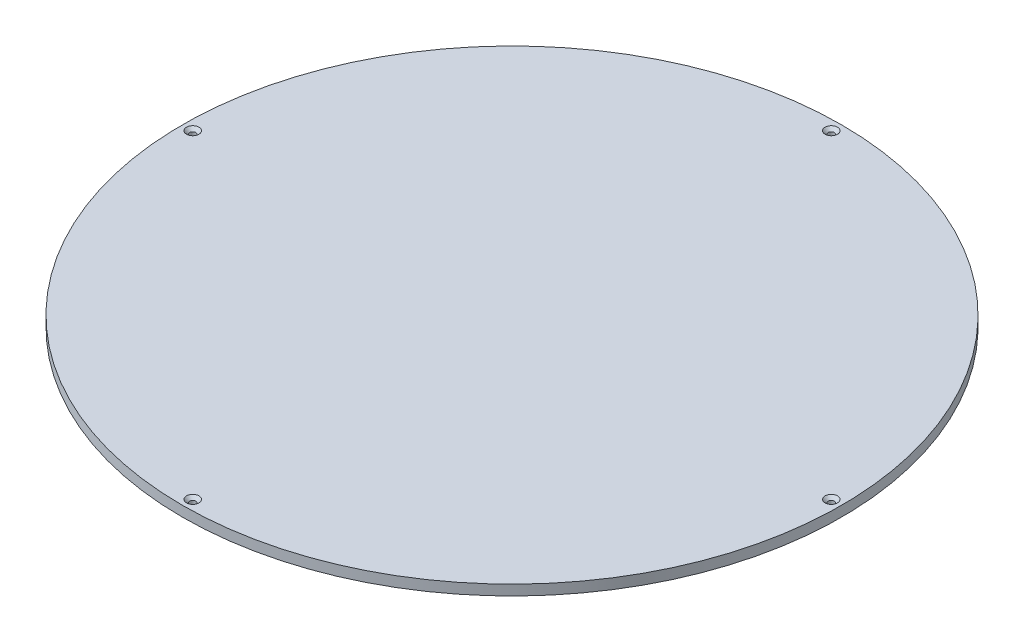
ISO-10303-21;
HEADER;
FILE_DESCRIPTION(('STEP AP214'),'2;1');
FILE_NAME('part.step','',(''),(''),'','','');
FILE_SCHEMA(('AUTOMOTIVE_DESIGN { 1 0 10303 214 1 1 1 1 }'));
ENDSEC;
DATA;
#1=APPLICATION_CONTEXT('core data for automotive mechanical design processes');
#2=APPLICATION_PROTOCOL_DEFINITION('international standard','automotive_design',2000,#1);
#3=PRODUCT_CONTEXT('',#1,'mechanical');
#4=PRODUCT('Part','Part','',(#3));
#5=PRODUCT_RELATED_PRODUCT_CATEGORY('part','',(#4));
#6=PRODUCT_DEFINITION_FORMATION('','',#4);
#7=PRODUCT_DEFINITION_CONTEXT('part definition',#1,'design');
#8=PRODUCT_DEFINITION('design','',#6,#7);
#9=PRODUCT_DEFINITION_SHAPE('','',#8);
#10=(LENGTH_UNIT() NAMED_UNIT(*) SI_UNIT(.MILLI.,.METRE.));
#11=(NAMED_UNIT(*) PLANE_ANGLE_UNIT() SI_UNIT($,.RADIAN.));
#12=(NAMED_UNIT(*) SI_UNIT($,.STERADIAN.) SOLID_ANGLE_UNIT());
#13=UNCERTAINTY_MEASURE_WITH_UNIT(LENGTH_MEASURE(1.E-05),#10,'distance_accuracy_value','');
#14=(GEOMETRIC_REPRESENTATION_CONTEXT(3) GLOBAL_UNCERTAINTY_ASSIGNED_CONTEXT((#13)) GLOBAL_UNIT_ASSIGNED_CONTEXT((#10,
#11,#12)) REPRESENTATION_CONTEXT('',''));
#15=CARTESIAN_POINT('',(0.,0.,0.));
#16=DIRECTION('',(0.,0.,1.));
#17=DIRECTION('',(1.,0.,0.));
#18=AXIS2_PLACEMENT_3D('',#15,#16,#17);
#19=CARTESIAN_POINT('',(0.,-5.,0.));
#20=DIRECTION('',(0.,1.,0.));
#21=DIRECTION('',(0.,0.,1.));
#22=AXIS2_PLACEMENT_3D('',#19,#20,#21);
#23=CYLINDRICAL_SURFACE('',#22,160.);
#24=CARTESIAN_POINT('',(0.,-5.,0.));
#25=DIRECTION('',(0.,1.,0.));
#26=DIRECTION('',(0.,0.,1.));
#27=AXIS2_PLACEMENT_3D('',#24,#25,#26);
#28=CIRCLE('',#27,160.);
#29=CARTESIAN_POINT('',(0.,-5.,160.));
#30=VERTEX_POINT('',#29);
#31=EDGE_CURVE('E65',#30,#30,#28,.T.);
#32=ORIENTED_EDGE('',*,*,#31,.T.);
#33=EDGE_LOOP('',(#32));
#34=FACE_BOUND('',#33,.T.);
#35=CARTESIAN_POINT('',(0.,0.,0.));
#36=DIRECTION('',(0.,1.,0.));
#37=DIRECTION('',(0.,0.,1.));
#38=AXIS2_PLACEMENT_3D('',#35,#36,#37);
#39=CIRCLE('',#38,160.);
#40=CARTESIAN_POINT('',(0.,0.,160.));
#41=VERTEX_POINT('',#40);
#42=EDGE_CURVE('E66',#41,#41,#39,.T.);
#43=ORIENTED_EDGE('',*,*,#42,.F.);
#44=EDGE_LOOP('',(#43));
#45=FACE_BOUND('',#44,.T.);
#46=ADVANCED_FACE('F33',(#34,#45),#23,.T.);
#47=CARTESIAN_POINT('',(0.,-5.,0.));
#48=DIRECTION('',(0.,1.,0.));
#49=DIRECTION('',(0.,0.,1.));
#50=AXIS2_PLACEMENT_3D('',#47,#48,#49);
#51=PLANE('',#50);
#52=CARTESIAN_POINT('',(1.62353882256206E-12,-5.,-155.));
#53=DIRECTION('',(0.,1.,0.));
#54=DIRECTION('',(0.,0.,1.));
#55=AXIS2_PLACEMENT_3D('',#52,#53,#54);
#56=CIRCLE('',#55,1.49999999999999);
#57=CARTESIAN_POINT('',(1.62353882256206E-12,-5.,-153.5));
#58=VERTEX_POINT('',#57);
#59=EDGE_CURVE('E80',#58,#58,#56,.T.);
#60=ORIENTED_EDGE('',*,*,#59,.T.);
#61=EDGE_LOOP('',(#60));
#62=FACE_BOUND('',#61,.T.);
#63=CARTESIAN_POINT('',(-155.,-5.,-1.08235921504137E-12));
#64=DIRECTION('',(0.,1.,0.));
#65=DIRECTION('',(0.,0.,1.));
#66=AXIS2_PLACEMENT_3D('',#63,#64,#65);
#67=CIRCLE('',#66,1.49999999999999);
#68=CARTESIAN_POINT('',(-155.,-5.,1.49999999999891));
#69=VERTEX_POINT('',#68);
#70=EDGE_CURVE('E77',#69,#69,#67,.T.);
#71=ORIENTED_EDGE('',*,*,#70,.T.);
#72=EDGE_LOOP('',(#71));
#73=FACE_BOUND('',#72,.T.);
#74=CARTESIAN_POINT('',(-5.41179607520686E-13,-5.,155.));
#75=DIRECTION('',(0.,1.,0.));
#76=DIRECTION('',(0.,0.,1.));
#77=AXIS2_PLACEMENT_3D('',#74,#75,#76);
#78=CIRCLE('',#77,1.5);
#79=CARTESIAN_POINT('',(-5.41179607520686E-13,-5.,156.5));
#80=VERTEX_POINT('',#79);
#81=EDGE_CURVE('E74',#80,#80,#78,.T.);
#82=ORIENTED_EDGE('',*,*,#81,.T.);
#83=EDGE_LOOP('',(#82));
#84=FACE_BOUND('',#83,.T.);
#85=CARTESIAN_POINT('',(155.,-5.,0.));
#86=DIRECTION('',(0.,1.,0.));
#87=DIRECTION('',(0.,0.,1.));
#88=AXIS2_PLACEMENT_3D('',#85,#86,#87);
#89=CIRCLE('',#88,1.5);
#90=CARTESIAN_POINT('',(155.,-5.,1.5));
#91=VERTEX_POINT('',#90);
#92=EDGE_CURVE('E69',#91,#91,#89,.T.);
#93=ORIENTED_EDGE('',*,*,#92,.T.);
#94=EDGE_LOOP('',(#93));
#95=FACE_BOUND('',#94,.T.);
#96=ORIENTED_EDGE('',*,*,#31,.F.);
#97=EDGE_LOOP('',(#96));
#98=FACE_BOUND('',#97,.T.);
#99=ADVANCED_FACE('F84',(#62,#73,#84,#95,#98),#51,.F.);
#100=CARTESIAN_POINT('',(0.,0.,0.));
#101=DIRECTION('',(0.,1.,0.));
#102=DIRECTION('',(0.,0.,1.));
#103=AXIS2_PLACEMENT_3D('',#100,#101,#102);
#104=PLANE('',#103);
#105=CARTESIAN_POINT('',(-155.,0.,-1.08235921504137E-12));
#106=DIRECTION('',(0.,1.,0.));
#107=DIRECTION('',(0.,0.,1.));
#108=AXIS2_PLACEMENT_3D('',#105,#106,#107);
#109=CIRCLE('',#108,2.99999999999995);
#110=CARTESIAN_POINT('',(-155.,0.,2.99999999999886));
#111=VERTEX_POINT('',#110);
#112=EDGE_CURVE('E48',#111,#111,#109,.F.);
#113=ORIENTED_EDGE('',*,*,#112,.T.);
#114=EDGE_LOOP('',(#113));
#115=FACE_BOUND('',#114,.T.);
#116=CARTESIAN_POINT('',(1.62353882256206E-12,0.,-155.));
#117=DIRECTION('',(0.,1.,0.));
#118=DIRECTION('',(0.,0.,1.));
#119=AXIS2_PLACEMENT_3D('',#116,#117,#118);
#120=CIRCLE('',#119,2.99999999999995);
#121=CARTESIAN_POINT('',(1.62353882256206E-12,0.,-152.));
#122=VERTEX_POINT('',#121);
#123=EDGE_CURVE('E53',#122,#122,#120,.F.);
#124=ORIENTED_EDGE('',*,*,#123,.T.);
#125=EDGE_LOOP('',(#124));
#126=FACE_BOUND('',#125,.T.);
#127=CARTESIAN_POINT('',(-5.41179607520686E-13,0.,155.));
#128=DIRECTION('',(0.,1.,0.));
#129=DIRECTION('',(0.,0.,1.));
#130=AXIS2_PLACEMENT_3D('',#127,#128,#129);
#131=CIRCLE('',#130,2.99999999999995);
#132=CARTESIAN_POINT('',(-5.41179607520686E-13,0.,158.));
#133=VERTEX_POINT('',#132);
#134=EDGE_CURVE('E56',#133,#133,#131,.F.);
#135=ORIENTED_EDGE('',*,*,#134,.T.);
#136=EDGE_LOOP('',(#135));
#137=FACE_BOUND('',#136,.T.);
#138=CARTESIAN_POINT('',(155.,0.,0.));
#139=DIRECTION('',(0.,1.,0.));
#140=DIRECTION('',(0.,0.,1.));
#141=AXIS2_PLACEMENT_3D('',#138,#139,#140);
#142=CIRCLE('',#141,3.);
#143=CARTESIAN_POINT('',(155.,0.,3.));
#144=VERTEX_POINT('',#143);
#145=EDGE_CURVE('E59',#144,#144,#142,.F.);
#146=ORIENTED_EDGE('',*,*,#145,.T.);
#147=EDGE_LOOP('',(#146));
#148=FACE_BOUND('',#147,.T.);
#149=ORIENTED_EDGE('',*,*,#42,.T.);
#150=EDGE_LOOP('',(#149));
#151=FACE_BOUND('',#150,.T.);
#152=ADVANCED_FACE('F109',(#115,#126,#137,#148,#151),#104,.T.);
#153=CARTESIAN_POINT('',(155.,-5.,0.));
#154=DIRECTION('',(0.,1.,0.));
#155=DIRECTION('',(0.,0.,1.));
#156=AXIS2_PLACEMENT_3D('',#153,#154,#155);
#157=CYLINDRICAL_SURFACE('',#156,1.5);
#158=CARTESIAN_POINT('',(155.,-1.49999999999996,0.));
#159=DIRECTION('',(0.,1.,0.));
#160=DIRECTION('',(0.,0.,1.));
#161=AXIS2_PLACEMENT_3D('',#158,#159,#160);
#162=CIRCLE('',#161,1.5);
#163=CARTESIAN_POINT('',(155.,-1.49999999999996,1.5));
#164=VERTEX_POINT('',#163);
#165=EDGE_CURVE('E10',#164,#164,#162,.T.);
#166=ORIENTED_EDGE('',*,*,#165,.T.);
#167=EDGE_LOOP('',(#166));
#168=FACE_BOUND('',#167,.T.);
#169=ORIENTED_EDGE('',*,*,#92,.F.);
#170=EDGE_LOOP('',(#169));
#171=FACE_BOUND('',#170,.T.);
#172=ADVANCED_FACE('F128',(#168,#171),#157,.F.);
#173=CARTESIAN_POINT('',(-5.41179607520686E-13,-5.,155.));
#174=DIRECTION('',(0.,1.,0.));
#175=DIRECTION('',(0.,0.,1.));
#176=AXIS2_PLACEMENT_3D('',#173,#174,#175);
#177=CYLINDRICAL_SURFACE('',#176,1.5);
#178=CARTESIAN_POINT('',(-5.41179607520686E-13,-1.49999999999996,155.));
#179=DIRECTION('',(0.,1.,0.));
#180=DIRECTION('',(0.,0.,1.));
#181=AXIS2_PLACEMENT_3D('',#178,#179,#180);
#182=CIRCLE('',#181,1.5);
#183=CARTESIAN_POINT('',(-5.41179607520686E-13,-1.49999999999996,156.5));
#184=VERTEX_POINT('',#183);
#185=EDGE_CURVE('E40',#184,#184,#182,.T.);
#186=ORIENTED_EDGE('',*,*,#185,.T.);
#187=EDGE_LOOP('',(#186));
#188=FACE_BOUND('',#187,.T.);
#189=ORIENTED_EDGE('',*,*,#81,.F.);
#190=EDGE_LOOP('',(#189));
#191=FACE_BOUND('',#190,.T.);
#192=ADVANCED_FACE('F100',(#188,#191),#177,.F.);
#193=CARTESIAN_POINT('',(-155.,-5.,-1.08235921504137E-12));
#194=DIRECTION('',(0.,1.,0.));
#195=DIRECTION('',(0.,0.,1.));
#196=AXIS2_PLACEMENT_3D('',#193,#194,#195);
#197=CYLINDRICAL_SURFACE('',#196,1.49999999999999);
#198=CARTESIAN_POINT('',(-155.,-1.49999999999996,-1.08235921504137E-12));
#199=DIRECTION('',(0.,1.,0.));
#200=DIRECTION('',(0.,0.,1.));
#201=AXIS2_PLACEMENT_3D('',#198,#199,#200);
#202=CIRCLE('',#201,1.49999999999999);
#203=CARTESIAN_POINT('',(-155.,-1.49999999999996,1.49999999999891));
#204=VERTEX_POINT('',#203);
#205=EDGE_CURVE('E62',#204,#204,#202,.T.);
#206=ORIENTED_EDGE('',*,*,#205,.T.);
#207=EDGE_LOOP('',(#206));
#208=FACE_BOUND('',#207,.T.);
#209=ORIENTED_EDGE('',*,*,#70,.F.);
#210=EDGE_LOOP('',(#209));
#211=FACE_BOUND('',#210,.T.);
#212=ADVANCED_FACE('F90',(#208,#211),#197,.F.);
#213=CARTESIAN_POINT('',(1.62353882256206E-12,-5.,-155.));
#214=DIRECTION('',(0.,1.,0.));
#215=DIRECTION('',(0.,0.,1.));
#216=AXIS2_PLACEMENT_3D('',#213,#214,#215);
#217=CYLINDRICAL_SURFACE('',#216,1.49999999999999);
#218=CARTESIAN_POINT('',(1.62353882256206E-12,-1.49999999999996,-155.));
#219=DIRECTION('',(0.,1.,0.));
#220=DIRECTION('',(0.,0.,1.));
#221=AXIS2_PLACEMENT_3D('',#218,#219,#220);
#222=CIRCLE('',#221,1.49999999999999);
#223=CARTESIAN_POINT('',(1.62353882256206E-12,-1.49999999999996,-153.5));
#224=VERTEX_POINT('',#223);
#225=EDGE_CURVE('E44',#224,#224,#222,.T.);
#226=ORIENTED_EDGE('',*,*,#225,.T.);
#227=EDGE_LOOP('',(#226));
#228=FACE_BOUND('',#227,.T.);
#229=ORIENTED_EDGE('',*,*,#59,.F.);
#230=EDGE_LOOP('',(#229));
#231=FACE_BOUND('',#230,.T.);
#232=ADVANCED_FACE('F87',(#228,#231),#217,.F.);
#233=CARTESIAN_POINT('',(-155.,-1.49999999999996,-1.08235921504137E-12));
#234=DIRECTION('',(0.,1.,0.));
#235=DIRECTION('',(0.,0.,1.));
#236=AXIS2_PLACEMENT_3D('',#233,#234,#235);
#237=CONICAL_SURFACE('',#236,1.49999999999999,0.785398163397447);
#238=ORIENTED_EDGE('',*,*,#112,.F.);
#239=EDGE_LOOP('',(#238));
#240=FACE_BOUND('',#239,.T.);
#241=ORIENTED_EDGE('',*,*,#205,.F.);
#242=EDGE_LOOP('',(#241));
#243=FACE_BOUND('',#242,.T.);
#244=ADVANCED_FACE('F89',(#240,#243),#237,.F.);
#245=CARTESIAN_POINT('',(1.62353882256206E-12,-1.49999999999996,-155.));
#246=DIRECTION('',(0.,1.,0.));
#247=DIRECTION('',(0.,0.,1.));
#248=AXIS2_PLACEMENT_3D('',#245,#246,#247);
#249=CONICAL_SURFACE('',#248,1.49999999999999,0.785398163397447);
#250=ORIENTED_EDGE('',*,*,#123,.F.);
#251=EDGE_LOOP('',(#250));
#252=FACE_BOUND('',#251,.T.);
#253=ORIENTED_EDGE('',*,*,#225,.F.);
#254=EDGE_LOOP('',(#253));
#255=FACE_BOUND('',#254,.T.);
#256=ADVANCED_FACE('F97',(#252,#255),#249,.F.);
#257=CARTESIAN_POINT('',(-5.41179607520686E-13,-1.49999999999996,155.));
#258=DIRECTION('',(0.,1.,0.));
#259=DIRECTION('',(0.,0.,1.));
#260=AXIS2_PLACEMENT_3D('',#257,#258,#259);
#261=CONICAL_SURFACE('',#260,1.5,0.785398163397447);
#262=CARTESIAN_POINT('',(-5.41179607520686E-13,0.,158.));
#263=CARTESIAN_POINT('',(-5.41179607520686E-13,-0.0156250000000001,157.984375));
#264=CARTESIAN_POINT('',(-5.41179607520686E-13,-0.0312499999999995,157.96875));
#265=CARTESIAN_POINT('',(-5.41179607520686E-13,-0.0624999999999984,157.9375));
#266=CARTESIAN_POINT('',(-5.41179607520686E-13,-0.0781249999999977,157.921875));
#267=CARTESIAN_POINT('',(-5.41179607520686E-13,-0.109374999999997,157.890625));
#268=CARTESIAN_POINT('',(-5.41179607520686E-13,-0.124999999999997,157.875));
#269=CARTESIAN_POINT('',(-5.41179607520686E-13,-0.156249999999995,157.84375));
#270=CARTESIAN_POINT('',(-5.41179607520686E-13,-0.171874999999992,157.828125));
#271=CARTESIAN_POINT('',(-5.41179607520686E-13,-0.203124999999993,157.796875));
#272=CARTESIAN_POINT('',(-5.41179607520686E-13,-0.218749999999996,157.78125));
#273=CARTESIAN_POINT('',(-5.41179607520686E-13,-0.249999999999996,157.75));
#274=CARTESIAN_POINT('',(-5.41179607520686E-13,-0.265624999999993,157.734375));
#275=CARTESIAN_POINT('',(-5.41179607520686E-13,-0.296874999999991,157.703125));
#276=CARTESIAN_POINT('',(-5.41179607520686E-13,-0.312499999999991,157.6875));
#277=CARTESIAN_POINT('',(-5.41179607520686E-13,-0.343749999999991,157.65625));
#278=CARTESIAN_POINT('',(-5.41179607520686E-13,-0.35937499999999,157.640625));
#279=CARTESIAN_POINT('',(-5.41179607520686E-13,-0.390624999999989,157.609375));
#280=CARTESIAN_POINT('',(-5.41179607520686E-13,-0.406249999999989,157.59375));
#281=CARTESIAN_POINT('',(-5.41179607520686E-13,-0.437499999999988,157.5625));
#282=CARTESIAN_POINT('',(-5.41179607520686E-13,-0.453124999999987,157.546875));
#283=CARTESIAN_POINT('',(-5.41179607520686E-13,-0.484374999999986,157.515625));
#284=CARTESIAN_POINT('',(-5.41179607520686E-13,-0.499999999999986,157.5));
#285=CARTESIAN_POINT('',(-5.41179607520686E-13,-0.531249999999984,157.46875));
#286=CARTESIAN_POINT('',(-5.41179607520686E-13,-0.546874999999981,157.453125));
#287=CARTESIAN_POINT('',(-5.41179607520686E-13,-0.578124999999982,157.421875));
#288=CARTESIAN_POINT('',(-5.41179607520686E-13,-0.593749999999985,157.40625));
#289=CARTESIAN_POINT('',(-5.41179607520686E-13,-0.624999999999985,157.375));
#290=CARTESIAN_POINT('',(-5.41179607520686E-13,-0.640624999999982,157.359375));
#291=CARTESIAN_POINT('',(-5.41179607520686E-13,-0.67187499999998,157.328125));
#292=CARTESIAN_POINT('',(-5.41179607520686E-13,-0.68749999999998,157.3125));
#293=CARTESIAN_POINT('',(-5.41179607520686E-13,-0.718749999999979,157.28125));
#294=CARTESIAN_POINT('',(-5.41179607520686E-13,-0.734374999999979,157.265625));
#295=CARTESIAN_POINT('',(-5.41179607520686E-13,-0.765624999999978,157.234375));
#296=CARTESIAN_POINT('',(-5.41179607520686E-13,-0.781249999999977,157.21875));
#297=CARTESIAN_POINT('',(-5.41179607520686E-13,-0.812499999999977,157.1875));
#298=CARTESIAN_POINT('',(-5.41179607520686E-13,-0.828124999999976,157.171875));
#299=CARTESIAN_POINT('',(-5.41179607520686E-13,-0.859374999999975,157.140625));
#300=CARTESIAN_POINT('',(-5.41179607520686E-13,-0.874999999999974,157.125));
#301=CARTESIAN_POINT('',(-5.41179607520686E-13,-0.906249999999974,157.09375));
#302=CARTESIAN_POINT('',(-5.41179607520686E-13,-0.921874999999974,157.078125));
#303=CARTESIAN_POINT('',(-5.41179607520686E-13,-0.953124999999972,157.046875));
#304=CARTESIAN_POINT('',(-5.41179607520686E-13,-0.968749999999969,157.03125));
#305=CARTESIAN_POINT('',(-5.41179607520686E-13,-0.999999999999969,157.));
#306=CARTESIAN_POINT('',(-5.41179607520686E-13,-1.01562499999997,156.984375));
#307=CARTESIAN_POINT('',(-5.41179607520686E-13,-1.04687499999997,156.953125));
#308=CARTESIAN_POINT('',(-5.41179607520686E-13,-1.06249999999997,156.9375));
#309=CARTESIAN_POINT('',(-5.41179607520686E-13,-1.09374999999997,156.90625));
#310=CARTESIAN_POINT('',(-5.41179607520686E-13,-1.10937499999997,156.890625));
#311=CARTESIAN_POINT('',(-5.41179607520686E-13,-1.14062499999997,156.859375));
#312=CARTESIAN_POINT('',(-5.41179607520686E-13,-1.15624999999997,156.84375));
#313=CARTESIAN_POINT('',(-5.41179607520686E-13,-1.18749999999997,156.8125));
#314=CARTESIAN_POINT('',(-5.41179607520686E-13,-1.20312499999997,156.796875));
#315=CARTESIAN_POINT('',(-5.41179607520686E-13,-1.23437499999996,156.765625));
#316=CARTESIAN_POINT('',(-5.41179607520686E-13,-1.24999999999996,156.75));
#317=CARTESIAN_POINT('',(-5.41179607520686E-13,-1.28124999999996,156.71875));
#318=CARTESIAN_POINT('',(-5.41179607520686E-13,-1.29687499999996,156.703125));
#319=CARTESIAN_POINT('',(-5.41179607520686E-13,-1.32812499999996,156.671875));
#320=CARTESIAN_POINT('',(-5.41179607520686E-13,-1.34374999999996,156.65625));
#321=CARTESIAN_POINT('',(-5.41179607520686E-13,-1.37499999999996,156.625));
#322=CARTESIAN_POINT('',(-5.41179607520686E-13,-1.39062499999996,156.609375));
#323=CARTESIAN_POINT('',(-5.41179607520686E-13,-1.42187499999996,156.578125));
#324=CARTESIAN_POINT('',(-5.41179607520686E-13,-1.43749999999996,156.5625));
#325=CARTESIAN_POINT('',(-5.41179607520686E-13,-1.46874999999996,156.53125));
#326=CARTESIAN_POINT('',(-5.41179607520686E-13,-1.48437499999995,156.515625));
#327=CARTESIAN_POINT('',(-5.41179607520686E-13,-1.49999999999996,156.5));
#328=B_SPLINE_CURVE_WITH_KNOTS('',3,(#262,#263,#264,#265,#266,#267,#268,#269,#270,#271,#272,
#273,#274,#275,#276,#277,#278,#279,#280,#281,#282,#283,#284,#285,#286,#287,#288,#289,#290,#291,
#292,#293,#294,#295,#296,#297,#298,#299,#300,#301,#302,#303,#304,#305,#306,#307,#308,#309,#310,
#311,#312,#313,#314,#315,#316,#317,#318,#319,#320,#321,#322,#323,#324,#325,#326,#327),
.UNSPECIFIED.,.F.,.F.,(4,2,2,2,2,2,2,2,2,2,2,2,2,2,2,2,2,2,2,2,2,2,2,2,2,2,2,2,2,2,2,2,4),(0.,
0.0662912607362392,0.132582521472478,0.198873782208717,0.265165042944957,0.331456303681176,
0.397747564417415,0.464038825153654,0.530330085889893,0.596621346626133,0.662912607362372,
0.729203868098611,0.79549512883485,0.861786389571069,0.928077650307309,0.994368911043548,
1.06066017177979,1.12695143251603,1.19324269325226,1.2595339539885,1.32582521472474,
1.39211647546098,1.4584077361972,1.52469899693344,1.59099025766968,1.65728151840592,
1.72357277914216,1.7898640398784,1.85615530061464,1.92244656135088,1.9887378220871,
2.05502908282333,2.12132034355957),.UNSPECIFIED.);
#329=EDGE_CURVE('BSEAM115',#133,#184,#328,.T.);
#330=ORIENTED_EDGE('',*,*,#134,.F.);
#331=ORIENTED_EDGE('',*,*,#185,.F.);
#332=ORIENTED_EDGE('',*,*,#329,.T.);
#333=ORIENTED_EDGE('',*,*,#329,.F.);
#334=EDGE_LOOP('',(#330,#332,#331,#333));
#335=FACE_BOUND('',#334,.T.);
#336=ADVANCED_FACE('F115',(#335),#261,.F.);
#337=CARTESIAN_POINT('',(155.,-1.49999999999996,0.));
#338=DIRECTION('',(0.,1.,0.));
#339=DIRECTION('',(0.,0.,1.));
#340=AXIS2_PLACEMENT_3D('',#337,#338,#339);
#341=CONICAL_SURFACE('',#340,1.5,0.785398163397465);
#342=ORIENTED_EDGE('',*,*,#145,.F.);
#343=EDGE_LOOP('',(#342));
#344=FACE_BOUND('',#343,.T.);
#345=ORIENTED_EDGE('',*,*,#165,.F.);
#346=EDGE_LOOP('',(#345));
#347=FACE_BOUND('',#346,.T.);
#348=ADVANCED_FACE('F35',(#344,#347),#341,.F.);
#349=CLOSED_SHELL('',(#46,#99,#152,#172,#192,#212,#232,#244,#256,#336,#348));
#350=MANIFOLD_SOLID_BREP('B2',#349);
#351=ADVANCED_BREP_SHAPE_REPRESENTATION('',(#18,#350),#14);
#352=SHAPE_DEFINITION_REPRESENTATION(#9,#351);
ENDSEC;
END-ISO-10303-21;
